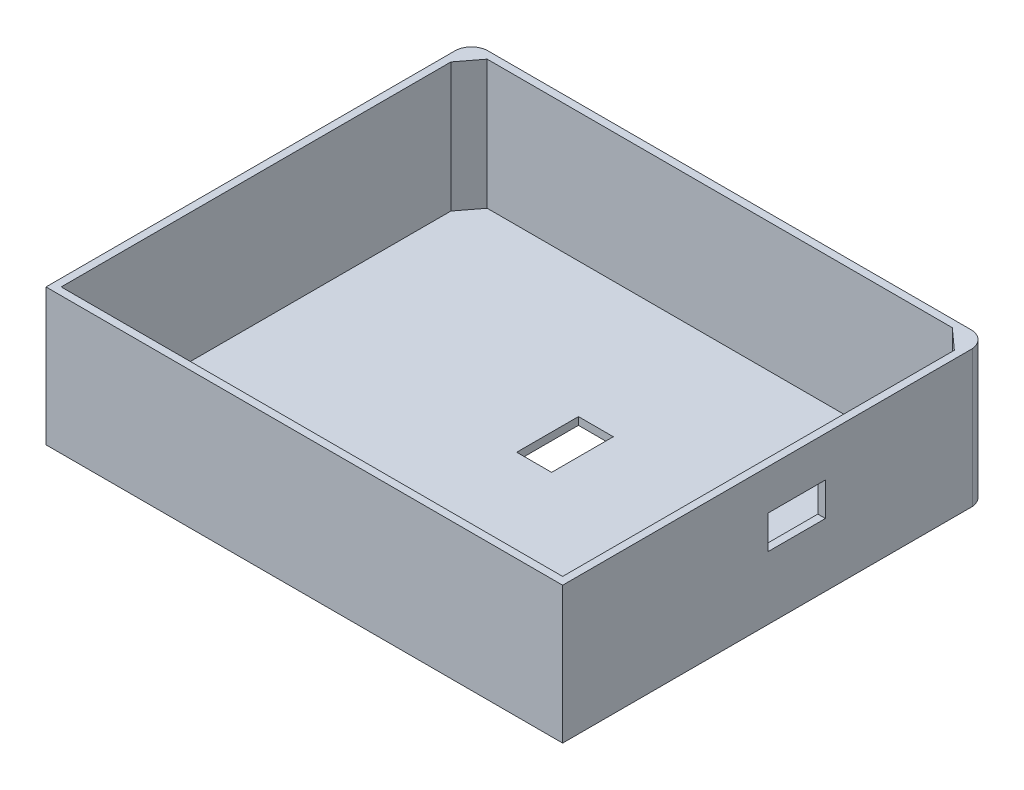
ISO-10303-21;
HEADER;
FILE_DESCRIPTION(('STEP AP214'),'2;1');
FILE_NAME('part.step','',(''),(''),'','','');
FILE_SCHEMA(('AUTOMOTIVE_DESIGN { 1 0 10303 214 1 1 1 1 }'));
ENDSEC;
DATA;
#1=APPLICATION_CONTEXT('core data for automotive mechanical design processes');
#2=APPLICATION_PROTOCOL_DEFINITION('international standard','automotive_design',2000,#1);
#3=PRODUCT_CONTEXT('',#1,'mechanical');
#4=PRODUCT('Part','Part','',(#3));
#5=PRODUCT_RELATED_PRODUCT_CATEGORY('part','',(#4));
#6=PRODUCT_DEFINITION_FORMATION('','',#4);
#7=PRODUCT_DEFINITION_CONTEXT('part definition',#1,'design');
#8=PRODUCT_DEFINITION('design','',#6,#7);
#9=PRODUCT_DEFINITION_SHAPE('','',#8);
#10=(LENGTH_UNIT() NAMED_UNIT(*) SI_UNIT(.MILLI.,.METRE.));
#11=(NAMED_UNIT(*) PLANE_ANGLE_UNIT() SI_UNIT($,.RADIAN.));
#12=(NAMED_UNIT(*) SI_UNIT($,.STERADIAN.) SOLID_ANGLE_UNIT());
#13=UNCERTAINTY_MEASURE_WITH_UNIT(LENGTH_MEASURE(1.E-05),#10,'distance_accuracy_value','');
#14=(GEOMETRIC_REPRESENTATION_CONTEXT(3) GLOBAL_UNCERTAINTY_ASSIGNED_CONTEXT((#13)) GLOBAL_UNIT_ASSIGNED_CONTEXT((#10,
#11,#12)) REPRESENTATION_CONTEXT('',''));
#15=CARTESIAN_POINT('',(0.,0.,0.));
#16=DIRECTION('',(0.,0.,1.));
#17=DIRECTION('',(1.,0.,0.));
#18=AXIS2_PLACEMENT_3D('',#15,#16,#17);
#19=CARTESIAN_POINT('',(-15.242841683718,9.,21.233665398935));
#20=DIRECTION('',(1.,0.,0.));
#21=DIRECTION('',(0.,0.,-1.));
#22=AXIS2_PLACEMENT_3D('',#19,#20,#21);
#23=PLANE('',#22);
#24=DIRECTION('',(0.,0.,1.));
#25=VECTOR('',#24,1.);
#26=CARTESIAN_POINT('',(-15.242841683718,9.,21.233665398935));
#27=LINE('',#26,#25);
#28=CARTESIAN_POINT('',(-15.242841683718,9.,-5.70365357414284));
#29=VERTEX_POINT('',#28);
#30=CARTESIAN_POINT('',(-15.242841683718,9.,21.233665398935));
#31=VERTEX_POINT('',#30);
#32=EDGE_CURVE('E380',#29,#31,#27,.T.);
#33=ORIENTED_EDGE('',*,*,#32,.F.);
#34=DIRECTION('',(0.,1.,0.));
#35=VECTOR('',#34,1.);
#36=CARTESIAN_POINT('',(-15.242841683718,0.,-5.70365357414284));
#37=LINE('',#36,#35);
#38=CARTESIAN_POINT('',(-15.242841683718,0.,-5.70365357414284));
#39=VERTEX_POINT('',#38);
#40=EDGE_CURVE('E298',#39,#29,#37,.T.);
#41=ORIENTED_EDGE('',*,*,#40,.F.);
#42=DIRECTION('',(0.,0.,1.));
#43=VECTOR('',#42,1.);
#44=CARTESIAN_POINT('',(-15.242841683718,0.,21.233665398935));
#45=LINE('',#44,#43);
#46=CARTESIAN_POINT('',(-15.242841683718,0.,21.233665398935));
#47=VERTEX_POINT('',#46);
#48=EDGE_CURVE('E364',#39,#47,#45,.T.);
#49=ORIENTED_EDGE('',*,*,#48,.T.);
#50=DIRECTION('',(0.,-1.,0.));
#51=VECTOR('',#50,1.);
#52=CARTESIAN_POINT('',(-15.242841683718,9.,21.233665398935));
#53=LINE('',#52,#51);
#54=EDGE_CURVE('E411',#31,#47,#53,.T.);
#55=ORIENTED_EDGE('',*,*,#54,.F.);
#56=EDGE_LOOP('',(#33,#41,#49,#55));
#57=FACE_BOUND('',#56,.T.);
#58=ADVANCED_FACE('F38',(#57),#23,.F.);
#59=CARTESIAN_POINT('',(18.7571583162821,9.,21.233665398935));
#60=DIRECTION('',(0.,0.,-1.));
#61=DIRECTION('',(-1.,0.,0.));
#62=AXIS2_PLACEMENT_3D('',#59,#60,#61);
#63=PLANE('',#62);
#64=DIRECTION('',(1.,0.,0.));
#65=VECTOR('',#64,1.);
#66=CARTESIAN_POINT('',(18.7571583162821,0.,21.233665398935));
#67=LINE('',#66,#65);
#68=CARTESIAN_POINT('',(18.7571583162821,0.,21.233665398935));
#69=VERTEX_POINT('',#68);
#70=EDGE_CURVE('E398',#47,#69,#67,.T.);
#71=ORIENTED_EDGE('',*,*,#70,.T.);
#72=DIRECTION('',(0.,-1.,0.));
#73=VECTOR('',#72,1.);
#74=CARTESIAN_POINT('',(18.7571583162821,9.,21.233665398935));
#75=LINE('',#74,#73);
#76=CARTESIAN_POINT('',(18.7571583162821,9.,21.233665398935));
#77=VERTEX_POINT('',#76);
#78=EDGE_CURVE('E395',#77,#69,#75,.T.);
#79=ORIENTED_EDGE('',*,*,#78,.F.);
#80=DIRECTION('',(1.,0.,0.));
#81=VECTOR('',#80,1.);
#82=CARTESIAN_POINT('',(18.7571583162821,9.,21.233665398935));
#83=LINE('',#82,#81);
#84=EDGE_CURVE('E383',#31,#77,#83,.T.);
#85=ORIENTED_EDGE('',*,*,#84,.F.);
#86=ORIENTED_EDGE('',*,*,#54,.T.);
#87=EDGE_LOOP('',(#71,#79,#85,#86));
#88=FACE_BOUND('',#87,.T.);
#89=ADVANCED_FACE('F442',(#88),#63,.F.);
#90=CARTESIAN_POINT('',(18.757158316282,9.,-6.76633460106505));
#91=DIRECTION('',(-1.,0.,0.));
#92=DIRECTION('',(0.,0.,1.));
#93=AXIS2_PLACEMENT_3D('',#90,#91,#92);
#94=PLANE('',#93);
#95=DIRECTION('',(0.,0.,1.));
#96=VECTOR('',#95,1.);
#97=CARTESIAN_POINT('',(18.757158316282,6.35152495832119,7.70439208325388));
#98=LINE('',#97,#96);
#99=CARTESIAN_POINT('',(18.757158316282,6.35152495832119,3.93857860870253));
#100=VERTEX_POINT('',#99);
#101=CARTESIAN_POINT('',(18.757158316282,6.35152495832119,7.70439208325388));
#102=VERTEX_POINT('',#101);
#103=EDGE_CURVE('E200',#100,#102,#98,.T.);
#104=ORIENTED_EDGE('',*,*,#103,.F.);
#105=DIRECTION('',(0.,1.,0.));
#106=VECTOR('',#105,1.);
#107=CARTESIAN_POINT('',(18.757158316282,6.35152495832119,3.93857860870253));
#108=LINE('',#107,#106);
#109=CARTESIAN_POINT('',(18.757158316282,4.15480043149957,3.93857860870253));
#110=VERTEX_POINT('',#109);
#111=EDGE_CURVE('E53',#110,#100,#108,.T.);
#112=ORIENTED_EDGE('',*,*,#111,.F.);
#113=DIRECTION('',(0.,0.,-1.));
#114=VECTOR('',#113,1.);
#115=CARTESIAN_POINT('',(18.757158316282,4.15480043149957,7.70439208325388));
#116=LINE('',#115,#114);
#117=CARTESIAN_POINT('',(18.757158316282,4.15480043149957,7.70439208325388));
#118=VERTEX_POINT('',#117);
#119=EDGE_CURVE('E208',#118,#110,#116,.T.);
#120=ORIENTED_EDGE('',*,*,#119,.F.);
#121=DIRECTION('',(0.,-1.,0.));
#122=VECTOR('',#121,1.);
#123=CARTESIAN_POINT('',(18.757158316282,6.35152495832119,7.70439208325388));
#124=LINE('',#123,#122);
#125=EDGE_CURVE('E190',#102,#118,#124,.T.);
#126=ORIENTED_EDGE('',*,*,#125,.F.);
#127=EDGE_LOOP('',(#104,#112,#120,#126));
#128=FACE_BOUND('',#127,.T.);
#129=DIRECTION('',(0.,0.,-1.));
#130=VECTOR('',#129,1.);
#131=CARTESIAN_POINT('',(18.757158316282,0.,-6.76633460106505));
#132=LINE('',#131,#130);
#133=CARTESIAN_POINT('',(18.757158316282,0.,-5.7458360096692));
#134=VERTEX_POINT('',#133);
#135=EDGE_CURVE('E401',#69,#134,#132,.T.);
#136=ORIENTED_EDGE('',*,*,#135,.T.);
#137=DIRECTION('',(0.,1.,0.));
#138=VECTOR('',#137,1.);
#139=CARTESIAN_POINT('',(18.757158316282,0.,-5.7458360096692));
#140=LINE('',#139,#138);
#141=CARTESIAN_POINT('',(18.757158316282,9.,-5.7458360096692));
#142=VERTEX_POINT('',#141);
#143=EDGE_CURVE('E301',#134,#142,#140,.T.);
#144=ORIENTED_EDGE('',*,*,#143,.T.);
#145=DIRECTION('',(0.,0.,-1.));
#146=VECTOR('',#145,1.);
#147=CARTESIAN_POINT('',(18.757158316282,9.,-6.76633460106505));
#148=LINE('',#147,#146);
#149=EDGE_CURVE('E387',#77,#142,#148,.T.);
#150=ORIENTED_EDGE('',*,*,#149,.F.);
#151=ORIENTED_EDGE('',*,*,#78,.T.);
#152=EDGE_LOOP('',(#136,#144,#150,#151));
#153=FACE_BOUND('',#152,.T.);
#154=ADVANCED_FACE('F205',(#128,#153),#94,.F.);
#155=CARTESIAN_POINT('',(-15.242841683718,9.,-6.76633460106505));
#156=DIRECTION('',(0.,0.,1.));
#157=DIRECTION('',(1.,0.,0.));
#158=AXIS2_PLACEMENT_3D('',#155,#156,#157);
#159=PLANE('',#158);
#160=DIRECTION('',(-1.,0.,0.));
#161=VECTOR('',#160,1.);
#162=CARTESIAN_POINT('',(-15.242841683718,0.,-6.76633460106505));
#163=LINE('',#162,#161);
#164=CARTESIAN_POINT('',(17.6675421503847,0.,-6.76633460106505));
#165=VERTEX_POINT('',#164);
#166=CARTESIAN_POINT('',(-14.1812434318439,0.,-6.76633460106505));
#167=VERTEX_POINT('',#166);
#168=EDGE_CURVE('E384',#165,#167,#163,.T.);
#169=ORIENTED_EDGE('',*,*,#168,.T.);
#170=DIRECTION('',(0.,1.,0.));
#171=VECTOR('',#170,1.);
#172=CARTESIAN_POINT('',(-14.1812434318439,0.,-6.76633460106505));
#173=LINE('',#172,#171);
#174=CARTESIAN_POINT('',(-14.1812434318439,9.,-6.76633460106505));
#175=VERTEX_POINT('',#174);
#176=EDGE_CURVE('E278',#167,#175,#173,.T.);
#177=ORIENTED_EDGE('',*,*,#176,.T.);
#178=DIRECTION('',(-1.,0.,0.));
#179=VECTOR('',#178,1.);
#180=CARTESIAN_POINT('',(-15.242841683718,9.,-6.76633460106505));
#181=LINE('',#180,#179);
#182=CARTESIAN_POINT('',(17.6675421503847,9.,-6.76633460106505));
#183=VERTEX_POINT('',#182);
#184=EDGE_CURVE('E391',#183,#175,#181,.T.);
#185=ORIENTED_EDGE('',*,*,#184,.F.);
#186=DIRECTION('',(0.,1.,0.));
#187=VECTOR('',#186,1.);
#188=CARTESIAN_POINT('',(17.6675421503847,0.,-6.76633460106505));
#189=LINE('',#188,#187);
#190=EDGE_CURVE('E294',#165,#183,#189,.T.);
#191=ORIENTED_EDGE('',*,*,#190,.F.);
#192=EDGE_LOOP('',(#169,#177,#185,#191));
#193=FACE_BOUND('',#192,.T.);
#194=ADVANCED_FACE('F467',(#193),#159,.F.);
#195=CARTESIAN_POINT('',(0.,9.,0.));
#196=DIRECTION('',(0.,-1.,0.));
#197=DIRECTION('',(0.,0.,-1.));
#198=AXIS2_PLACEMENT_3D('',#195,#196,#197);
#199=PLANE('',#198);
#200=DIRECTION('',(-0.607764068228583,0.,0.794117647058823));
#201=VECTOR('',#200,1.);
#202=CARTESIAN_POINT('',(-13.7096427677294,9.,-6.26633460106504));
#203=LINE('',#202,#201);
#204=CARTESIAN_POINT('',(-13.7096427677294,9.,-6.26633460106504));
#205=VERTEX_POINT('',#204);
#206=CARTESIAN_POINT('',(-14.742841683718,9.,-4.91633460106504));
#207=VERTEX_POINT('',#206);
#208=EDGE_CURVE('E342',#205,#207,#203,.T.);
#209=ORIENTED_EDGE('',*,*,#208,.F.);
#210=DIRECTION('',(-1.,0.,0.));
#211=VECTOR('',#210,1.);
#212=CARTESIAN_POINT('',(16.903908893596,9.,-6.26633460106505));
#213=LINE('',#212,#211);
#214=CARTESIAN_POINT('',(16.903908893596,9.,-6.26633460106505));
#215=VERTEX_POINT('',#214);
#216=EDGE_CURVE('E314',#215,#205,#213,.T.);
#217=ORIENTED_EDGE('',*,*,#216,.F.);
#218=DIRECTION('',(-0.742727454822175,0.,-0.669593852908892));
#219=VECTOR('',#218,1.);
#220=CARTESIAN_POINT('',(18.2571583162821,9.,-5.04633460106505));
#221=LINE('',#220,#219);
#222=CARTESIAN_POINT('',(18.2571583162821,9.,-5.04633460106505));
#223=VERTEX_POINT('',#222);
#224=EDGE_CURVE('E320',#223,#215,#221,.T.);
#225=ORIENTED_EDGE('',*,*,#224,.F.);
#226=DIRECTION('',(0.,0.,-1.));
#227=VECTOR('',#226,1.);
#228=CARTESIAN_POINT('',(18.2571583162821,9.,20.733665398935));
#229=LINE('',#228,#227);
#230=CARTESIAN_POINT('',(18.2571583162821,9.,20.733665398935));
#231=VERTEX_POINT('',#230);
#232=EDGE_CURVE('E354',#231,#223,#229,.T.);
#233=ORIENTED_EDGE('',*,*,#232,.F.);
#234=DIRECTION('',(1.,0.,0.));
#235=VECTOR('',#234,1.);
#236=CARTESIAN_POINT('',(-14.742841683718,9.,20.733665398935));
#237=LINE('',#236,#235);
#238=CARTESIAN_POINT('',(-14.742841683718,9.,20.733665398935));
#239=VERTEX_POINT('',#238);
#240=EDGE_CURVE('E350',#239,#231,#237,.T.);
#241=ORIENTED_EDGE('',*,*,#240,.F.);
#242=DIRECTION('',(0.,0.,1.));
#243=VECTOR('',#242,1.);
#244=CARTESIAN_POINT('',(-14.742841683718,9.,17.2064801412054));
#245=LINE('',#244,#243);
#246=EDGE_CURVE('E346',#207,#239,#245,.T.);
#247=ORIENTED_EDGE('',*,*,#246,.F.);
#248=EDGE_LOOP('',(#209,#217,#225,#233,#241,#247));
#249=FACE_BOUND('',#248,.T.);
#250=DIRECTION('',(0.944684771177397,0.,-0.327979699227726));
#251=VECTOR('',#250,1.);
#252=CARTESIAN_POINT('',(-14.1848589110137,9.,-6.76507936354362));
#253=LINE('',#252,#251);
#254=CARTESIAN_POINT('',(-14.1848589110137,9.,-6.76507936354362));
#255=VERTEX_POINT('',#254);
#256=EDGE_CURVE('E269',#255,#175,#253,.T.);
#257=ORIENTED_EDGE('',*,*,#256,.F.);
#258=DIRECTION('',(0.995905241343719,0.,-0.0904032646761695));
#259=VECTOR('',#258,1.);
#260=CARTESIAN_POINT('',(-15.3302659582118,9.,-6.66110507748596));
#261=LINE('',#260,#259);
#262=CARTESIAN_POINT('',(-14.3270513861701,9.,-6.75217184640959));
#263=VERTEX_POINT('',#262);
#264=EDGE_CURVE('E263',#263,#255,#261,.T.);
#265=ORIENTED_EDGE('',*,*,#264,.F.);
#266=CARTESIAN_POINT('',(-14.1580790778587,9.,-5.68039804102192));
#267=DIRECTION('',(0.,-1.,0.));
#268=DIRECTION('',(0.,0.,-1.));
#269=AXIS2_PLACEMENT_3D('',#266,#267,#268);
#270=CIRCLE('',#269,1.08501185748878);
#271=EDGE_CURVE('E289',#29,#263,#270,.T.);
#272=ORIENTED_EDGE('',*,*,#271,.F.);
#273=ORIENTED_EDGE('',*,*,#32,.T.);
#274=ORIENTED_EDGE('',*,*,#84,.T.);
#275=ORIENTED_EDGE('',*,*,#149,.T.);
#276=CARTESIAN_POINT('',(17.6185470007771,9.,-5.62206424251548));
#277=DIRECTION('',(0.,-1.,0.));
#278=DIRECTION('',(0.,0.,-1.));
#279=AXIS2_PLACEMENT_3D('',#276,#277,#278);
#280=CIRCLE('',#279,1.14531881069867);
#281=EDGE_CURVE('E295',#183,#142,#280,.T.);
#282=ORIENTED_EDGE('',*,*,#281,.F.);
#283=ORIENTED_EDGE('',*,*,#184,.T.);
#284=EDGE_LOOP('',(#257,#265,#272,#273,#274,#275,#282,#283));
#285=FACE_BOUND('',#284,.T.);
#286=ADVANCED_FACE('F456',(#249,#285),#199,.F.);
#287=CARTESIAN_POINT('',(0.,0.,0.));
#288=DIRECTION('',(0.,-1.,0.));
#289=DIRECTION('',(0.,0.,-1.));
#290=AXIS2_PLACEMENT_3D('',#287,#288,#289);
#291=PLANE('',#290);
#292=DIRECTION('',(0.,0.,1.));
#293=VECTOR('',#292,1.);
#294=CARTESIAN_POINT('',(3.46285030181412,0.,0.));
#295=LINE('',#294,#293);
#296=CARTESIAN_POINT('',(3.46285030181412,0.,2.60393000963363));
#297=VERTEX_POINT('',#296);
#298=CARTESIAN_POINT('',(3.46285030181412,0.,6.66510140375763));
#299=VERTEX_POINT('',#298);
#300=EDGE_CURVE('E260',#297,#299,#295,.T.);
#301=ORIENTED_EDGE('',*,*,#300,.F.);
#302=DIRECTION('',(1.,0.,0.));
#303=VECTOR('',#302,1.);
#304=CARTESIAN_POINT('',(0.,0.,2.60393000963363));
#305=LINE('',#304,#303);
#306=CARTESIAN_POINT('',(1.16688508748723,0.,2.60393000963363));
#307=VERTEX_POINT('',#306);
#308=EDGE_CURVE('E241',#307,#297,#305,.T.);
#309=ORIENTED_EDGE('',*,*,#308,.F.);
#310=DIRECTION('',(0.,0.,-1.));
#311=VECTOR('',#310,1.);
#312=CARTESIAN_POINT('',(1.16688508748723,0.,0.));
#313=LINE('',#312,#311);
#314=CARTESIAN_POINT('',(1.16688508748723,0.,6.66510140375763));
#315=VERTEX_POINT('',#314);
#316=EDGE_CURVE('E253',#315,#307,#313,.T.);
#317=ORIENTED_EDGE('',*,*,#316,.F.);
#318=DIRECTION('',(-1.,0.,0.));
#319=VECTOR('',#318,1.);
#320=CARTESIAN_POINT('',(0.,0.,6.66510140375763));
#321=LINE('',#320,#319);
#322=EDGE_CURVE('E257',#299,#315,#321,.T.);
#323=ORIENTED_EDGE('',*,*,#322,.F.);
#324=EDGE_LOOP('',(#301,#309,#317,#323));
#325=FACE_BOUND('',#324,.T.);
#326=DIRECTION('',(0.995905241343719,0.,-0.0904032646761695));
#327=VECTOR('',#326,1.);
#328=CARTESIAN_POINT('',(-15.3302659582118,0.,-6.66110507748596));
#329=LINE('',#328,#327);
#330=CARTESIAN_POINT('',(-14.3270513861701,0.,-6.75217184640959));
#331=VERTEX_POINT('',#330);
#332=CARTESIAN_POINT('',(-14.1848589110137,0.,-6.76507936354362));
#333=VERTEX_POINT('',#332);
#334=EDGE_CURVE('E264',#331,#333,#329,.T.);
#335=ORIENTED_EDGE('',*,*,#334,.T.);
#336=DIRECTION('',(0.944684771177397,0.,-0.327979699227726));
#337=VECTOR('',#336,1.);
#338=CARTESIAN_POINT('',(-14.1848589110137,0.,-6.76507936354362));
#339=LINE('',#338,#337);
#340=EDGE_CURVE('E268',#333,#167,#339,.T.);
#341=ORIENTED_EDGE('',*,*,#340,.T.);
#342=ORIENTED_EDGE('',*,*,#168,.F.);
#343=CARTESIAN_POINT('',(17.6185470007771,0.,-5.62206424251548));
#344=DIRECTION('',(0.,-1.,0.));
#345=DIRECTION('',(0.,0.,-1.));
#346=AXIS2_PLACEMENT_3D('',#343,#344,#345);
#347=CIRCLE('',#346,1.14531881069867);
#348=EDGE_CURVE('E290',#165,#134,#347,.T.);
#349=ORIENTED_EDGE('',*,*,#348,.T.);
#350=ORIENTED_EDGE('',*,*,#135,.F.);
#351=ORIENTED_EDGE('',*,*,#70,.F.);
#352=ORIENTED_EDGE('',*,*,#48,.F.);
#353=CARTESIAN_POINT('',(-14.1580790778587,0.,-5.68039804102192));
#354=DIRECTION('',(0.,-1.,0.));
#355=DIRECTION('',(0.,0.,-1.));
#356=AXIS2_PLACEMENT_3D('',#353,#354,#355);
#357=CIRCLE('',#356,1.08501185748878);
#358=EDGE_CURVE('E302',#39,#331,#357,.T.);
#359=ORIENTED_EDGE('',*,*,#358,.T.);
#360=EDGE_LOOP('',(#335,#341,#342,#349,#350,#351,#352,#359));
#361=FACE_BOUND('',#360,.T.);
#362=ADVANCED_FACE('F473',(#325,#361),#291,.T.);
#363=CARTESIAN_POINT('',(16.903908893596,0.499999999999999,-6.26633460106505));
#364=DIRECTION('',(0.,0.,-1.));
#365=DIRECTION('',(-1.,0.,0.));
#366=AXIS2_PLACEMENT_3D('',#363,#364,#365);
#367=PLANE('',#366);
#368=ORIENTED_EDGE('',*,*,#216,.T.);
#369=DIRECTION('',(0.,1.,0.));
#370=VECTOR('',#369,1.);
#371=CARTESIAN_POINT('',(-13.7096427677294,0.499999999999999,-6.26633460106504));
#372=LINE('',#371,#370);
#373=CARTESIAN_POINT('',(-13.7096427677294,0.499999999999999,-6.26633460106504));
#374=VERTEX_POINT('',#373);
#375=EDGE_CURVE('E339',#374,#205,#372,.T.);
#376=ORIENTED_EDGE('',*,*,#375,.F.);
#377=DIRECTION('',(-1.,0.,0.));
#378=VECTOR('',#377,1.);
#379=CARTESIAN_POINT('',(16.903908893596,0.499999999999999,-6.26633460106505));
#380=LINE('',#379,#378);
#381=CARTESIAN_POINT('',(16.903908893596,0.499999999999999,-6.26633460106505));
#382=VERTEX_POINT('',#381);
#383=EDGE_CURVE('E315',#382,#374,#380,.T.);
#384=ORIENTED_EDGE('',*,*,#383,.F.);
#385=DIRECTION('',(0.,1.,0.));
#386=VECTOR('',#385,1.);
#387=CARTESIAN_POINT('',(16.903908893596,0.499999999999999,-6.26633460106505));
#388=LINE('',#387,#386);
#389=EDGE_CURVE('E361',#382,#215,#388,.T.);
#390=ORIENTED_EDGE('',*,*,#389,.T.);
#391=EDGE_LOOP('',(#368,#376,#384,#390));
#392=FACE_BOUND('',#391,.T.);
#393=ADVANCED_FACE('F496',(#392),#367,.F.);
#394=CARTESIAN_POINT('',(18.2571583162821,0.499999999999999,-5.04633460106505));
#395=DIRECTION('',(0.669593852908892,0.,-0.742727454822175));
#396=DIRECTION('',(-0.742727454822175,0.,-0.669593852908892));
#397=AXIS2_PLACEMENT_3D('',#394,#395,#396);
#398=PLANE('',#397);
#399=ORIENTED_EDGE('',*,*,#224,.T.);
#400=ORIENTED_EDGE('',*,*,#389,.F.);
#401=DIRECTION('',(-0.742727454822175,0.,-0.669593852908892));
#402=VECTOR('',#401,1.);
#403=CARTESIAN_POINT('',(18.2571583162821,0.499999999999999,-5.04633460106505));
#404=LINE('',#403,#402);
#405=CARTESIAN_POINT('',(18.2571583162821,0.499999999999999,-5.04633460106505));
#406=VERTEX_POINT('',#405);
#407=EDGE_CURVE('E335',#406,#382,#404,.T.);
#408=ORIENTED_EDGE('',*,*,#407,.F.);
#409=DIRECTION('',(0.,1.,0.));
#410=VECTOR('',#409,1.);
#411=CARTESIAN_POINT('',(18.2571583162821,0.499999999999999,-5.04633460106505));
#412=LINE('',#411,#410);
#413=EDGE_CURVE('E365',#406,#223,#412,.T.);
#414=ORIENTED_EDGE('',*,*,#413,.T.);
#415=EDGE_LOOP('',(#399,#400,#408,#414));
#416=FACE_BOUND('',#415,.T.);
#417=ADVANCED_FACE('F493',(#416),#398,.F.);
#418=CARTESIAN_POINT('',(18.2571583162821,0.499999999999999,20.733665398935));
#419=DIRECTION('',(1.,0.,0.));
#420=DIRECTION('',(0.,0.,-1.));
#421=AXIS2_PLACEMENT_3D('',#418,#419,#420);
#422=PLANE('',#421);
#423=DIRECTION('',(0.,0.,-1.));
#424=VECTOR('',#423,1.);
#425=CARTESIAN_POINT('',(18.2571583162821,4.15480043149957,20.733665398935));
#426=LINE('',#425,#424);
#427=CARTESIAN_POINT('',(18.2571583162821,4.15480043149957,7.70439208325388));
#428=VERTEX_POINT('',#427);
#429=CARTESIAN_POINT('',(18.2571583162821,4.15480043149957,3.93857860870253));
#430=VERTEX_POINT('',#429);
#431=EDGE_CURVE('E46',#428,#430,#426,.T.);
#432=ORIENTED_EDGE('',*,*,#431,.T.);
#433=DIRECTION('',(0.,1.,0.));
#434=VECTOR('',#433,1.);
#435=CARTESIAN_POINT('',(18.2571583162821,0.499999999999999,3.93857860870253));
#436=LINE('',#435,#434);
#437=CARTESIAN_POINT('',(18.2571583162821,6.35152495832119,3.93857860870253));
#438=VERTEX_POINT('',#437);
#439=EDGE_CURVE('E11',#430,#438,#436,.T.);
#440=ORIENTED_EDGE('',*,*,#439,.T.);
#441=DIRECTION('',(0.,0.,1.));
#442=VECTOR('',#441,1.);
#443=CARTESIAN_POINT('',(18.2571583162821,6.35152495832119,20.733665398935));
#444=LINE('',#443,#442);
#445=CARTESIAN_POINT('',(18.2571583162821,6.35152495832119,7.70439208325388));
#446=VERTEX_POINT('',#445);
#447=EDGE_CURVE('E415',#438,#446,#444,.T.);
#448=ORIENTED_EDGE('',*,*,#447,.T.);
#449=DIRECTION('',(0.,-1.,0.));
#450=VECTOR('',#449,1.);
#451=CARTESIAN_POINT('',(18.2571583162821,0.499999999999999,7.70439208325388));
#452=LINE('',#451,#450);
#453=EDGE_CURVE('E193',#446,#428,#452,.T.);
#454=ORIENTED_EDGE('',*,*,#453,.T.);
#455=EDGE_LOOP('',(#432,#440,#448,#454));
#456=FACE_BOUND('',#455,.T.);
#457=ORIENTED_EDGE('',*,*,#232,.T.);
#458=ORIENTED_EDGE('',*,*,#413,.F.);
#459=DIRECTION('',(0.,0.,-1.));
#460=VECTOR('',#459,1.);
#461=CARTESIAN_POINT('',(18.2571583162821,0.499999999999999,20.733665398935));
#462=LINE('',#461,#460);
#463=CARTESIAN_POINT('',(18.2571583162821,0.499999999999999,20.733665398935));
#464=VERTEX_POINT('',#463);
#465=EDGE_CURVE('E331',#464,#406,#462,.T.);
#466=ORIENTED_EDGE('',*,*,#465,.F.);
#467=DIRECTION('',(0.,1.,0.));
#468=VECTOR('',#467,1.);
#469=CARTESIAN_POINT('',(18.2571583162821,0.499999999999999,20.733665398935));
#470=LINE('',#469,#468);
#471=EDGE_CURVE('E368',#464,#231,#470,.T.);
#472=ORIENTED_EDGE('',*,*,#471,.T.);
#473=EDGE_LOOP('',(#457,#458,#466,#472));
#474=FACE_BOUND('',#473,.T.);
#475=ADVANCED_FACE('F422',(#456,#474),#422,.F.);
#476=CARTESIAN_POINT('',(-14.742841683718,0.499999999999999,20.733665398935));
#477=DIRECTION('',(0.,0.,1.));
#478=DIRECTION('',(1.,0.,0.));
#479=AXIS2_PLACEMENT_3D('',#476,#477,#478);
#480=PLANE('',#479);
#481=ORIENTED_EDGE('',*,*,#240,.T.);
#482=ORIENTED_EDGE('',*,*,#471,.F.);
#483=DIRECTION('',(1.,0.,0.));
#484=VECTOR('',#483,1.);
#485=CARTESIAN_POINT('',(-14.742841683718,0.499999999999999,20.733665398935));
#486=LINE('',#485,#484);
#487=CARTESIAN_POINT('',(-14.742841683718,0.499999999999999,20.733665398935));
#488=VERTEX_POINT('',#487);
#489=EDGE_CURVE('E327',#488,#464,#486,.T.);
#490=ORIENTED_EDGE('',*,*,#489,.F.);
#491=DIRECTION('',(0.,1.,0.));
#492=VECTOR('',#491,1.);
#493=CARTESIAN_POINT('',(-14.742841683718,0.499999999999999,20.733665398935));
#494=LINE('',#493,#492);
#495=EDGE_CURVE('E371',#488,#239,#494,.T.);
#496=ORIENTED_EDGE('',*,*,#495,.T.);
#497=EDGE_LOOP('',(#481,#482,#490,#496));
#498=FACE_BOUND('',#497,.T.);
#499=ADVANCED_FACE('F500',(#498),#480,.F.);
#500=CARTESIAN_POINT('',(-14.742841683718,0.499999999999999,17.2064801412054));
#501=DIRECTION('',(-1.,0.,0.));
#502=DIRECTION('',(0.,0.,1.));
#503=AXIS2_PLACEMENT_3D('',#500,#501,#502);
#504=PLANE('',#503);
#505=ORIENTED_EDGE('',*,*,#246,.T.);
#506=ORIENTED_EDGE('',*,*,#495,.F.);
#507=DIRECTION('',(0.,0.,1.));
#508=VECTOR('',#507,1.);
#509=CARTESIAN_POINT('',(-14.742841683718,0.499999999999999,-4.91633460106504));
#510=LINE('',#509,#508);
#511=CARTESIAN_POINT('',(-14.742841683718,0.499999999999999,-4.91633460106504));
#512=VERTEX_POINT('',#511);
#513=EDGE_CURVE('E324',#512,#488,#510,.T.);
#514=ORIENTED_EDGE('',*,*,#513,.F.);
#515=DIRECTION('',(0.,1.,0.));
#516=VECTOR('',#515,1.);
#517=CARTESIAN_POINT('',(-14.742841683718,0.499999999999999,-4.91633460106504));
#518=LINE('',#517,#516);
#519=EDGE_CURVE('E374',#512,#207,#518,.T.);
#520=ORIENTED_EDGE('',*,*,#519,.T.);
#521=EDGE_LOOP('',(#505,#506,#514,#520));
#522=FACE_BOUND('',#521,.T.);
#523=ADVANCED_FACE('F503',(#522),#504,.F.);
#524=CARTESIAN_POINT('',(-13.7096427677294,0.499999999999999,-6.26633460106504));
#525=DIRECTION('',(-0.794117647058824,0.,-0.607764068228583));
#526=DIRECTION('',(-0.607764068228583,0.,0.794117647058824));
#527=AXIS2_PLACEMENT_3D('',#524,#525,#526);
#528=PLANE('',#527);
#529=ORIENTED_EDGE('',*,*,#208,.T.);
#530=ORIENTED_EDGE('',*,*,#519,.F.);
#531=DIRECTION('',(-0.607764068228583,0.,0.794117647058823));
#532=VECTOR('',#531,1.);
#533=CARTESIAN_POINT('',(-13.7096427677294,0.499999999999999,-6.26633460106504));
#534=LINE('',#533,#532);
#535=EDGE_CURVE('E319',#374,#512,#534,.T.);
#536=ORIENTED_EDGE('',*,*,#535,.F.);
#537=ORIENTED_EDGE('',*,*,#375,.T.);
#538=EDGE_LOOP('',(#529,#530,#536,#537));
#539=FACE_BOUND('',#538,.T.);
#540=ADVANCED_FACE('F488',(#539),#528,.F.);
#541=CARTESIAN_POINT('',(0.,0.499999999999999,0.));
#542=DIRECTION('',(0.,1.,0.));
#543=DIRECTION('',(0.,0.,1.));
#544=AXIS2_PLACEMENT_3D('',#541,#542,#543);
#545=PLANE('',#544);
#546=DIRECTION('',(0.,0.,-1.));
#547=VECTOR('',#546,1.);
#548=CARTESIAN_POINT('',(3.46285030181412,0.499999999999999,2.60393000963363));
#549=LINE('',#548,#547);
#550=CARTESIAN_POINT('',(3.46285030181412,0.499999999999999,6.66510140375763));
#551=VERTEX_POINT('',#550);
#552=CARTESIAN_POINT('',(3.46285030181412,0.499999999999999,2.60393000963363));
#553=VERTEX_POINT('',#552);
#554=EDGE_CURVE('E218',#551,#553,#549,.T.);
#555=ORIENTED_EDGE('',*,*,#554,.F.);
#556=DIRECTION('',(1.,0.,0.));
#557=VECTOR('',#556,1.);
#558=CARTESIAN_POINT('',(1.16688508748723,0.499999999999999,6.66510140375763));
#559=LINE('',#558,#557);
#560=CARTESIAN_POINT('',(1.16688508748723,0.499999999999999,6.66510140375763));
#561=VERTEX_POINT('',#560);
#562=EDGE_CURVE('E233',#561,#551,#559,.T.);
#563=ORIENTED_EDGE('',*,*,#562,.F.);
#564=DIRECTION('',(0.,0.,1.));
#565=VECTOR('',#564,1.);
#566=CARTESIAN_POINT('',(1.16688508748723,0.499999999999999,2.60393000963363));
#567=LINE('',#566,#565);
#568=CARTESIAN_POINT('',(1.16688508748723,0.499999999999999,2.60393000963363));
#569=VERTEX_POINT('',#568);
#570=EDGE_CURVE('E229',#569,#561,#567,.T.);
#571=ORIENTED_EDGE('',*,*,#570,.F.);
#572=DIRECTION('',(-1.,0.,0.));
#573=VECTOR('',#572,1.);
#574=CARTESIAN_POINT('',(1.16688508748723,0.499999999999999,2.60393000963363));
#575=LINE('',#574,#573);
#576=EDGE_CURVE('E225',#553,#569,#575,.T.);
#577=ORIENTED_EDGE('',*,*,#576,.F.);
#578=EDGE_LOOP('',(#555,#563,#571,#577));
#579=FACE_BOUND('',#578,.T.);
#580=ORIENTED_EDGE('',*,*,#383,.T.);
#581=ORIENTED_EDGE('',*,*,#535,.T.);
#582=ORIENTED_EDGE('',*,*,#513,.T.);
#583=ORIENTED_EDGE('',*,*,#489,.T.);
#584=ORIENTED_EDGE('',*,*,#465,.T.);
#585=ORIENTED_EDGE('',*,*,#407,.T.);
#586=EDGE_LOOP('',(#580,#581,#582,#583,#584,#585));
#587=FACE_BOUND('',#586,.T.);
#588=ADVANCED_FACE('F480',(#579,#587),#545,.T.);
#589=CARTESIAN_POINT('',(-14.1580790778587,0.,-5.68039804102192));
#590=DIRECTION('',(0.,1.,0.));
#591=DIRECTION('',(0.,0.,1.));
#592=AXIS2_PLACEMENT_3D('',#589,#590,#591);
#593=CYLINDRICAL_SURFACE('',#592,1.08501185748878);
#594=ORIENTED_EDGE('',*,*,#271,.T.);
#595=DIRECTION('',(0.,1.,0.));
#596=VECTOR('',#595,1.);
#597=CARTESIAN_POINT('',(-14.3270513861701,0.,-6.75217184640959));
#598=LINE('',#597,#596);
#599=EDGE_CURVE('E282',#263,#331,#598,.F.);
#600=ORIENTED_EDGE('',*,*,#599,.T.);
#601=ORIENTED_EDGE('',*,*,#358,.F.);
#602=ORIENTED_EDGE('',*,*,#40,.T.);
#603=EDGE_LOOP('',(#594,#600,#601,#602));
#604=FACE_BOUND('',#603,.T.);
#605=ADVANCED_FACE('F477',(#604),#593,.T.);
#606=CARTESIAN_POINT('',(17.6185470007771,0.,-5.62206424251548));
#607=DIRECTION('',(0.,1.,0.));
#608=DIRECTION('',(0.,0.,1.));
#609=AXIS2_PLACEMENT_3D('',#606,#607,#608);
#610=CYLINDRICAL_SURFACE('',#609,1.14531881069867);
#611=ORIENTED_EDGE('',*,*,#348,.F.);
#612=ORIENTED_EDGE('',*,*,#190,.T.);
#613=ORIENTED_EDGE('',*,*,#281,.T.);
#614=ORIENTED_EDGE('',*,*,#143,.F.);
#615=EDGE_LOOP('',(#611,#612,#613,#614));
#616=FACE_BOUND('',#615,.T.);
#617=ADVANCED_FACE('F479',(#616),#610,.T.);
#618=CARTESIAN_POINT('',(-15.3302659582118,0.,-6.66110507748596));
#619=DIRECTION('',(0.0904032646761695,0.,0.995905241343719));
#620=DIRECTION('',(0.995905241343719,0.,-0.0904032646761695));
#621=AXIS2_PLACEMENT_3D('',#618,#619,#620);
#622=PLANE('',#621);
#623=ORIENTED_EDGE('',*,*,#264,.T.);
#624=DIRECTION('',(0.,1.,0.));
#625=VECTOR('',#624,1.);
#626=CARTESIAN_POINT('',(-14.1848589110137,0.,-6.76507936354362));
#627=LINE('',#626,#625);
#628=EDGE_CURVE('E273',#333,#255,#627,.T.);
#629=ORIENTED_EDGE('',*,*,#628,.F.);
#630=ORIENTED_EDGE('',*,*,#334,.F.);
#631=ORIENTED_EDGE('',*,*,#599,.F.);
#632=EDGE_LOOP('',(#623,#629,#630,#631));
#633=FACE_BOUND('',#632,.T.);
#634=ADVANCED_FACE('F475',(#633),#622,.F.);
#635=CARTESIAN_POINT('',(-14.1848589110137,0.,-6.76507936354362));
#636=DIRECTION('',(0.327979699227726,0.,0.944684771177397));
#637=DIRECTION('',(0.944684771177397,0.,-0.327979699227726));
#638=AXIS2_PLACEMENT_3D('',#635,#636,#637);
#639=PLANE('',#638);
#640=ORIENTED_EDGE('',*,*,#256,.T.);
#641=ORIENTED_EDGE('',*,*,#176,.F.);
#642=ORIENTED_EDGE('',*,*,#340,.F.);
#643=ORIENTED_EDGE('',*,*,#628,.T.);
#644=EDGE_LOOP('',(#640,#641,#642,#643));
#645=FACE_BOUND('',#644,.T.);
#646=ADVANCED_FACE('F471',(#645),#639,.F.);
#647=CARTESIAN_POINT('',(3.46285030181412,-8.5,2.60393000963363));
#648=DIRECTION('',(1.,0.,0.));
#649=DIRECTION('',(0.,0.,-1.));
#650=AXIS2_PLACEMENT_3D('',#647,#648,#649);
#651=PLANE('',#650);
#652=ORIENTED_EDGE('',*,*,#300,.T.);
#653=DIRECTION('',(0.,1.,0.));
#654=VECTOR('',#653,1.);
#655=CARTESIAN_POINT('',(3.46285030181412,-8.5,6.66510140375763));
#656=LINE('',#655,#654);
#657=EDGE_CURVE('E238',#299,#551,#656,.T.);
#658=ORIENTED_EDGE('',*,*,#657,.T.);
#659=ORIENTED_EDGE('',*,*,#554,.T.);
#660=DIRECTION('',(0.,1.,0.));
#661=VECTOR('',#660,1.);
#662=CARTESIAN_POINT('',(3.46285030181412,-8.5,2.60393000963363));
#663=LINE('',#662,#661);
#664=EDGE_CURVE('E237',#297,#553,#663,.T.);
#665=ORIENTED_EDGE('',*,*,#664,.F.);
#666=EDGE_LOOP('',(#652,#658,#659,#665));
#667=FACE_BOUND('',#666,.T.);
#668=ADVANCED_FACE('F576',(#667),#651,.F.);
#669=CARTESIAN_POINT('',(1.16688508748723,-8.5,6.66510140375763));
#670=DIRECTION('',(0.,0.,1.));
#671=DIRECTION('',(1.,0.,0.));
#672=AXIS2_PLACEMENT_3D('',#669,#670,#671);
#673=PLANE('',#672);
#674=ORIENTED_EDGE('',*,*,#322,.T.);
#675=DIRECTION('',(0.,1.,0.));
#676=VECTOR('',#675,1.);
#677=CARTESIAN_POINT('',(1.16688508748723,-8.5,6.66510140375763));
#678=LINE('',#677,#676);
#679=EDGE_CURVE('E242',#315,#561,#678,.T.);
#680=ORIENTED_EDGE('',*,*,#679,.T.);
#681=ORIENTED_EDGE('',*,*,#562,.T.);
#682=ORIENTED_EDGE('',*,*,#657,.F.);
#683=EDGE_LOOP('',(#674,#680,#681,#682));
#684=FACE_BOUND('',#683,.T.);
#685=ADVANCED_FACE('F567',(#684),#673,.F.);
#686=CARTESIAN_POINT('',(1.16688508748723,-8.5,2.60393000963363));
#687=DIRECTION('',(-1.,0.,0.));
#688=DIRECTION('',(0.,0.,1.));
#689=AXIS2_PLACEMENT_3D('',#686,#687,#688);
#690=PLANE('',#689);
#691=ORIENTED_EDGE('',*,*,#316,.T.);
#692=DIRECTION('',(0.,1.,0.));
#693=VECTOR('',#692,1.);
#694=CARTESIAN_POINT('',(1.16688508748723,-8.5,2.60393000963363));
#695=LINE('',#694,#693);
#696=EDGE_CURVE('E245',#307,#569,#695,.T.);
#697=ORIENTED_EDGE('',*,*,#696,.T.);
#698=ORIENTED_EDGE('',*,*,#570,.T.);
#699=ORIENTED_EDGE('',*,*,#679,.F.);
#700=EDGE_LOOP('',(#691,#697,#698,#699));
#701=FACE_BOUND('',#700,.T.);
#702=ADVANCED_FACE('F436',(#701),#690,.F.);
#703=CARTESIAN_POINT('',(1.16688508748723,-8.5,2.60393000963363));
#704=DIRECTION('',(0.,0.,-1.));
#705=DIRECTION('',(-1.,0.,0.));
#706=AXIS2_PLACEMENT_3D('',#703,#704,#705);
#707=PLANE('',#706);
#708=ORIENTED_EDGE('',*,*,#308,.T.);
#709=ORIENTED_EDGE('',*,*,#664,.T.);
#710=ORIENTED_EDGE('',*,*,#576,.T.);
#711=ORIENTED_EDGE('',*,*,#696,.F.);
#712=EDGE_LOOP('',(#708,#709,#710,#711));
#713=FACE_BOUND('',#712,.T.);
#714=ADVANCED_FACE('F429',(#713),#707,.F.);
#715=CARTESIAN_POINT('',(9.75715831628205,6.35152495832119,3.93857860870253));
#716=DIRECTION('',(0.,0.,-1.));
#717=DIRECTION('',(-1.,0.,0.));
#718=AXIS2_PLACEMENT_3D('',#715,#716,#717);
#719=PLANE('',#718);
#720=DIRECTION('',(1.,0.,0.));
#721=VECTOR('',#720,1.);
#722=CARTESIAN_POINT('',(9.75715831628205,4.15480043149957,3.93857860870253));
#723=LINE('',#722,#721);
#724=EDGE_CURVE('E215',#430,#110,#723,.T.);
#725=ORIENTED_EDGE('',*,*,#724,.T.);
#726=ORIENTED_EDGE('',*,*,#111,.T.);
#727=DIRECTION('',(1.,0.,0.));
#728=VECTOR('',#727,1.);
#729=CARTESIAN_POINT('',(9.75715831628205,6.35152495832119,3.93857860870253));
#730=LINE('',#729,#728);
#731=EDGE_CURVE('E197',#438,#100,#730,.T.);
#732=ORIENTED_EDGE('',*,*,#731,.F.);
#733=ORIENTED_EDGE('',*,*,#439,.F.);
#734=EDGE_LOOP('',(#725,#726,#732,#733));
#735=FACE_BOUND('',#734,.T.);
#736=ADVANCED_FACE('F427',(#735),#719,.F.);
#737=CARTESIAN_POINT('',(9.75715831628205,4.15480043149957,7.70439208325388));
#738=DIRECTION('',(0.,-1.,0.));
#739=DIRECTION('',(0.,0.,-1.));
#740=AXIS2_PLACEMENT_3D('',#737,#738,#739);
#741=PLANE('',#740);
#742=DIRECTION('',(1.,0.,0.));
#743=VECTOR('',#742,1.);
#744=CARTESIAN_POINT('',(9.75715831628205,4.15480043149957,7.70439208325388));
#745=LINE('',#744,#743);
#746=EDGE_CURVE('E196',#428,#118,#745,.T.);
#747=ORIENTED_EDGE('',*,*,#746,.T.);
#748=ORIENTED_EDGE('',*,*,#119,.T.);
#749=ORIENTED_EDGE('',*,*,#724,.F.);
#750=ORIENTED_EDGE('',*,*,#431,.F.);
#751=EDGE_LOOP('',(#747,#748,#749,#750));
#752=FACE_BOUND('',#751,.T.);
#753=ADVANCED_FACE('F426',(#752),#741,.F.);
#754=CARTESIAN_POINT('',(9.75715831628205,6.35152495832119,7.70439208325388));
#755=DIRECTION('',(0.,0.,1.));
#756=DIRECTION('',(1.,0.,0.));
#757=AXIS2_PLACEMENT_3D('',#754,#755,#756);
#758=PLANE('',#757);
#759=DIRECTION('',(1.,0.,0.));
#760=VECTOR('',#759,1.);
#761=CARTESIAN_POINT('',(9.75715831628205,6.35152495832119,7.70439208325388));
#762=LINE('',#761,#760);
#763=EDGE_CURVE('E61',#446,#102,#762,.T.);
#764=ORIENTED_EDGE('',*,*,#763,.T.);
#765=ORIENTED_EDGE('',*,*,#125,.T.);
#766=ORIENTED_EDGE('',*,*,#746,.F.);
#767=ORIENTED_EDGE('',*,*,#453,.F.);
#768=EDGE_LOOP('',(#764,#765,#766,#767));
#769=FACE_BOUND('',#768,.T.);
#770=ADVANCED_FACE('F187',(#769),#758,.F.);
#771=CARTESIAN_POINT('',(9.75715831628205,6.35152495832119,7.70439208325388));
#772=DIRECTION('',(0.,1.,0.));
#773=DIRECTION('',(0.,0.,1.));
#774=AXIS2_PLACEMENT_3D('',#771,#772,#773);
#775=PLANE('',#774);
#776=ORIENTED_EDGE('',*,*,#731,.T.);
#777=ORIENTED_EDGE('',*,*,#103,.T.);
#778=ORIENTED_EDGE('',*,*,#763,.F.);
#779=ORIENTED_EDGE('',*,*,#447,.F.);
#780=EDGE_LOOP('',(#776,#777,#778,#779));
#781=FACE_BOUND('',#780,.T.);
#782=ADVANCED_FACE('F201',(#781),#775,.F.);
#783=CLOSED_SHELL('',(#58,#89,#154,#194,#286,#362,#393,#417,#475,#499,#523,#540,#588,#605,#617,
#634,#646,#668,#685,#702,#714,#736,#753,#770,#782));
#784=MANIFOLD_SOLID_BREP('B2',#783);
#785=ADVANCED_BREP_SHAPE_REPRESENTATION('',(#18,#784),#14);
#786=SHAPE_DEFINITION_REPRESENTATION(#9,#785);
ENDSEC;
END-ISO-10303-21;
